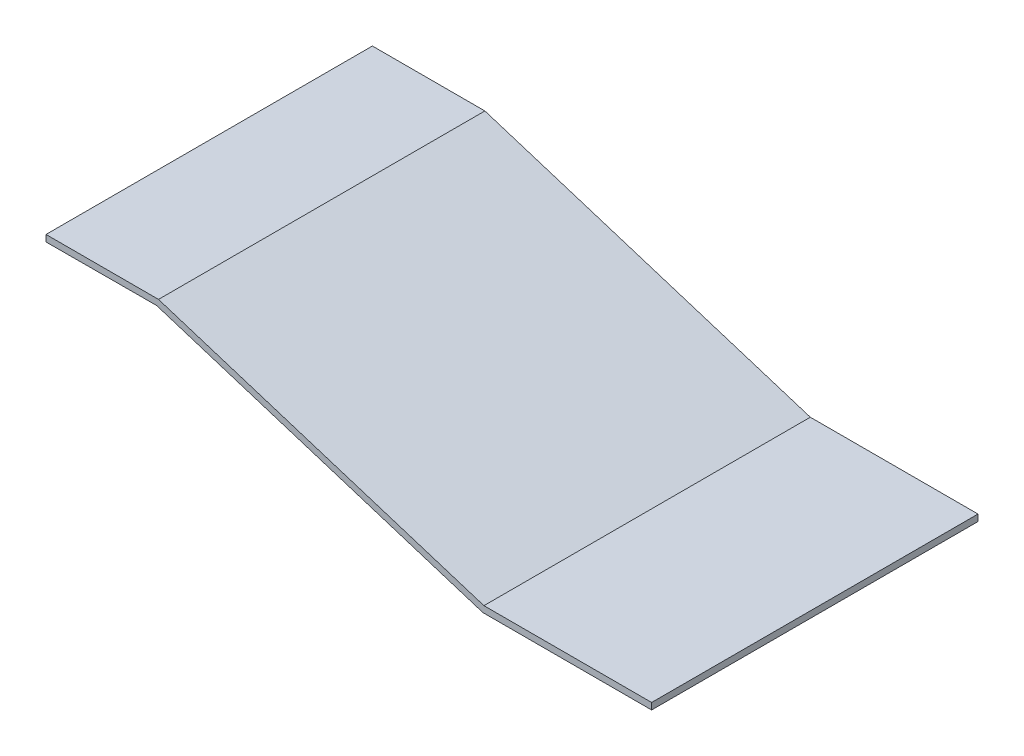
ISO-10303-21;
HEADER;
FILE_DESCRIPTION(('STEP AP214'),'2;1');
FILE_NAME('part.step','',(''),(''),'','','');
FILE_SCHEMA(('AUTOMOTIVE_DESIGN { 1 0 10303 214 1 1 1 1 }'));
ENDSEC;
DATA;
#1=APPLICATION_CONTEXT('core data for automotive mechanical design processes');
#2=APPLICATION_PROTOCOL_DEFINITION('international standard','automotive_design',2000,#1);
#3=PRODUCT_CONTEXT('',#1,'mechanical');
#4=PRODUCT('Part','Part','',(#3));
#5=PRODUCT_RELATED_PRODUCT_CATEGORY('part','',(#4));
#6=PRODUCT_DEFINITION_FORMATION('','',#4);
#7=PRODUCT_DEFINITION_CONTEXT('part definition',#1,'design');
#8=PRODUCT_DEFINITION('design','',#6,#7);
#9=PRODUCT_DEFINITION_SHAPE('','',#8);
#10=(LENGTH_UNIT() NAMED_UNIT(*) SI_UNIT(.MILLI.,.METRE.));
#11=(NAMED_UNIT(*) PLANE_ANGLE_UNIT() SI_UNIT($,.RADIAN.));
#12=(NAMED_UNIT(*) SI_UNIT($,.STERADIAN.) SOLID_ANGLE_UNIT());
#13=UNCERTAINTY_MEASURE_WITH_UNIT(LENGTH_MEASURE(1.E-05),#10,'distance_accuracy_value','');
#14=(GEOMETRIC_REPRESENTATION_CONTEXT(3) GLOBAL_UNCERTAINTY_ASSIGNED_CONTEXT((#13)) GLOBAL_UNIT_ASSIGNED_CONTEXT((#10,
#11,#12)) REPRESENTATION_CONTEXT('',''));
#15=CARTESIAN_POINT('',(0.,0.,0.));
#16=DIRECTION('',(0.,0.,1.));
#17=DIRECTION('',(1.,0.,0.));
#18=AXIS2_PLACEMENT_3D('',#15,#16,#17);
#19=CARTESIAN_POINT('',(1855.58831432889,-257.414889175095,1000.));
#20=DIRECTION('',(0.,-1.,0.));
#21=DIRECTION('',(0.,0.,-1.));
#22=AXIS2_PLACEMENT_3D('',#19,#20,#21);
#23=PLANE('',#22);
#24=DIRECTION('',(-1.,0.,0.));
#25=VECTOR('',#24,1.);
#26=CARTESIAN_POINT('',(1855.58831432889,-257.414889175095,1000.));
#27=LINE('',#26,#25);
#28=CARTESIAN_POINT('',(1855.58831432889,-257.414889175095,1000.));
#29=VERTEX_POINT('',#28);
#30=CARTESIAN_POINT('',(1338.71947180938,-257.414889175095,1000.));
#31=VERTEX_POINT('',#30);
#32=EDGE_CURVE('E230',#29,#31,#27,.T.);
#33=ORIENTED_EDGE('',*,*,#32,.T.);
#34=DIRECTION('',(0.,0.,-1.));
#35=VECTOR('',#34,1.);
#36=CARTESIAN_POINT('',(1338.71947180938,-257.414889175095,1000.));
#37=LINE('',#36,#35);
#38=CARTESIAN_POINT('',(1338.71947180938,-257.414889175095,0.));
#39=VERTEX_POINT('',#38);
#40=EDGE_CURVE('E213',#31,#39,#37,.T.);
#41=ORIENTED_EDGE('',*,*,#40,.T.);
#42=DIRECTION('',(-1.,0.,0.));
#43=VECTOR('',#42,1.);
#44=CARTESIAN_POINT('',(1855.58831432889,-257.414889175095,0.));
#45=LINE('',#44,#43);
#46=CARTESIAN_POINT('',(1855.58831432889,-257.414889175095,0.));
#47=VERTEX_POINT('',#46);
#48=EDGE_CURVE('E130',#47,#39,#45,.T.);
#49=ORIENTED_EDGE('',*,*,#48,.F.);
#50=DIRECTION('',(0.,0.,-1.));
#51=VECTOR('',#50,1.);
#52=CARTESIAN_POINT('',(1855.58831432889,-257.414889175095,1000.));
#53=LINE('',#52,#51);
#54=EDGE_CURVE('E79',#29,#47,#53,.T.);
#55=ORIENTED_EDGE('',*,*,#54,.F.);
#56=EDGE_LOOP('',(#33,#41,#49,#55));
#57=FACE_BOUND('',#56,.T.);
#58=ADVANCED_FACE('F69',(#57),#23,.T.);
#59=CARTESIAN_POINT('',(1855.58831432889,-237.414889175095,1000.));
#60=DIRECTION('',(1.,0.,0.));
#61=DIRECTION('',(0.,0.,-1.));
#62=AXIS2_PLACEMENT_3D('',#59,#60,#61);
#63=PLANE('',#62);
#64=DIRECTION('',(0.,-1.,0.));
#65=VECTOR('',#64,1.);
#66=CARTESIAN_POINT('',(1855.58831432889,-237.414889175095,0.));
#67=LINE('',#66,#65);
#68=CARTESIAN_POINT('',(1855.58831432889,-237.414889175095,0.));
#69=VERTEX_POINT('',#68);
#70=EDGE_CURVE('E241',#69,#47,#67,.T.);
#71=ORIENTED_EDGE('',*,*,#70,.F.);
#72=DIRECTION('',(0.,0.,-1.));
#73=VECTOR('',#72,1.);
#74=CARTESIAN_POINT('',(1855.58831432889,-237.414889175095,1000.));
#75=LINE('',#74,#73);
#76=CARTESIAN_POINT('',(1855.58831432889,-237.414889175095,1000.));
#77=VERTEX_POINT('',#76);
#78=EDGE_CURVE('E235',#77,#69,#75,.T.);
#79=ORIENTED_EDGE('',*,*,#78,.F.);
#80=DIRECTION('',(0.,-1.,0.));
#81=VECTOR('',#80,1.);
#82=CARTESIAN_POINT('',(1855.58831432889,-237.414889175095,1000.));
#83=LINE('',#82,#81);
#84=EDGE_CURVE('E239',#77,#29,#83,.T.);
#85=ORIENTED_EDGE('',*,*,#84,.T.);
#86=ORIENTED_EDGE('',*,*,#54,.T.);
#87=EDGE_LOOP('',(#71,#79,#85,#86));
#88=FACE_BOUND('',#87,.T.);
#89=ADVANCED_FACE('F192',(#88),#63,.T.);
#90=CARTESIAN_POINT('',(1338.71947180938,-237.414889175095,1000.));
#91=DIRECTION('',(0.,1.,0.));
#92=DIRECTION('',(0.,0.,1.));
#93=AXIS2_PLACEMENT_3D('',#90,#91,#92);
#94=PLANE('',#93);
#95=DIRECTION('',(0.,0.,-1.));
#96=VECTOR('',#95,1.);
#97=CARTESIAN_POINT('',(1341.79498395651,-237.414889175095,1000.));
#98=LINE('',#97,#96);
#99=CARTESIAN_POINT('',(1341.79498395651,-237.414889175096,1000.));
#100=VERTEX_POINT('',#99);
#101=CARTESIAN_POINT('',(1341.79498395651,-237.414889175096,0.));
#102=VERTEX_POINT('',#101);
#103=EDGE_CURVE('E12',#100,#102,#98,.T.);
#104=ORIENTED_EDGE('',*,*,#103,.F.);
#105=DIRECTION('',(1.,0.,0.));
#106=VECTOR('',#105,1.);
#107=CARTESIAN_POINT('',(1338.71947180938,-237.414889175095,1000.));
#108=LINE('',#107,#106);
#109=EDGE_CURVE('E232',#100,#77,#108,.T.);
#110=ORIENTED_EDGE('',*,*,#109,.T.);
#111=ORIENTED_EDGE('',*,*,#78,.T.);
#112=DIRECTION('',(1.,0.,0.));
#113=VECTOR('',#112,1.);
#114=CARTESIAN_POINT('',(1338.71947180938,-237.414889175095,0.));
#115=LINE('',#114,#113);
#116=EDGE_CURVE('E252',#102,#69,#115,.T.);
#117=ORIENTED_EDGE('',*,*,#116,.F.);
#118=EDGE_LOOP('',(#104,#110,#111,#117));
#119=FACE_BOUND('',#118,.T.);
#120=ADVANCED_FACE('F198',(#119),#94,.T.);
#121=CARTESIAN_POINT('',(0.,0.,0.));
#122=DIRECTION('',(0.,0.,-1.));
#123=DIRECTION('',(-1.,0.,0.));
#124=AXIS2_PLACEMENT_3D('',#121,#122,#123);
#125=PLANE('',#124);
#126=ORIENTED_EDGE('',*,*,#48,.T.);
#127=DIRECTION('',(-0.953798645697972,0.300446573394861,0.));
#128=VECTOR('',#127,1.);
#129=CARTESIAN_POINT('',(1338.71947180938,-257.414889175095,0.));
#130=LINE('',#129,#128);
#131=CARTESIAN_POINT('',(338.719471809376,57.5851108249049,0.));
#132=VERTEX_POINT('',#131);
#133=EDGE_CURVE('E170',#39,#132,#130,.T.);
#134=ORIENTED_EDGE('',*,*,#133,.T.);
#135=DIRECTION('',(-0.999996279025813,-0.00272799093250725,0.));
#136=VECTOR('',#135,1.);
#137=CARTESIAN_POINT('',(338.719471809376,57.5851108249049,0.));
#138=LINE('',#137,#136);
#139=CARTESIAN_POINT('',(0.,56.6610837388643,0.));
#140=VERTEX_POINT('',#139);
#141=EDGE_CURVE('E174',#132,#140,#138,.T.);
#142=ORIENTED_EDGE('',*,*,#141,.T.);
#143=DIRECTION('',(0.,1.,0.));
#144=VECTOR('',#143,1.);
#145=CARTESIAN_POINT('',(0.,56.6610837388643,0.));
#146=LINE('',#145,#144);
#147=CARTESIAN_POINT('',(0.,76.6610837388643,0.));
#148=VERTEX_POINT('',#147);
#149=EDGE_CURVE('E139',#140,#148,#146,.T.);
#150=ORIENTED_EDGE('',*,*,#149,.T.);
#151=DIRECTION('',(1.,0.,0.));
#152=VECTOR('',#151,1.);
#153=CARTESIAN_POINT('',(0.,76.6610837388643,0.));
#154=LINE('',#153,#152);
#155=CARTESIAN_POINT('',(344.728403277274,76.6610837388643,0.));
#156=VERTEX_POINT('',#155);
#157=EDGE_CURVE('E122',#148,#156,#154,.T.);
#158=ORIENTED_EDGE('',*,*,#157,.T.);
#159=DIRECTION('',(0.953798645697972,-0.300446573394861,0.));
#160=VECTOR('',#159,1.);
#161=CARTESIAN_POINT('',(344.728403277274,76.6610837388643,0.));
#162=LINE('',#161,#160);
#163=EDGE_CURVE('E137',#156,#102,#162,.T.);
#164=ORIENTED_EDGE('',*,*,#163,.T.);
#165=ORIENTED_EDGE('',*,*,#116,.T.);
#166=ORIENTED_EDGE('',*,*,#70,.T.);
#167=EDGE_LOOP('',(#126,#134,#142,#150,#158,#164,#165,#166));
#168=FACE_BOUND('',#167,.T.);
#169=ADVANCED_FACE('F135',(#168),#125,.T.);
#170=CARTESIAN_POINT('',(0.,0.,1000.));
#171=DIRECTION('',(0.,0.,-1.));
#172=DIRECTION('',(-1.,0.,0.));
#173=AXIS2_PLACEMENT_3D('',#170,#171,#172);
#174=PLANE('',#173);
#175=ORIENTED_EDGE('',*,*,#109,.F.);
#176=DIRECTION('',(0.953798645697972,-0.300446573394861,0.));
#177=VECTOR('',#176,1.);
#178=CARTESIAN_POINT('',(344.728403277274,76.6610837388643,1000.));
#179=LINE('',#178,#177);
#180=CARTESIAN_POINT('',(344.728403277274,76.6610837388643,1000.));
#181=VERTEX_POINT('',#180);
#182=EDGE_CURVE('E158',#181,#100,#179,.T.);
#183=ORIENTED_EDGE('',*,*,#182,.F.);
#184=DIRECTION('',(1.,0.,0.));
#185=VECTOR('',#184,1.);
#186=CARTESIAN_POINT('',(0.,76.6610837388643,1000.));
#187=LINE('',#186,#185);
#188=CARTESIAN_POINT('',(0.,76.6610837388643,1000.));
#189=VERTEX_POINT('',#188);
#190=EDGE_CURVE('E125',#189,#181,#187,.T.);
#191=ORIENTED_EDGE('',*,*,#190,.F.);
#192=DIRECTION('',(0.,1.,0.));
#193=VECTOR('',#192,1.);
#194=CARTESIAN_POINT('',(0.,56.6610837388643,1000.));
#195=LINE('',#194,#193);
#196=CARTESIAN_POINT('',(0.,56.6610837388643,1000.));
#197=VERTEX_POINT('',#196);
#198=EDGE_CURVE('E166',#197,#189,#195,.T.);
#199=ORIENTED_EDGE('',*,*,#198,.F.);
#200=DIRECTION('',(-0.999996279025813,-0.00272799093250725,0.));
#201=VECTOR('',#200,1.);
#202=CARTESIAN_POINT('',(338.719471809376,57.5851108249049,1000.));
#203=LINE('',#202,#201);
#204=CARTESIAN_POINT('',(338.719471809376,57.5851108249049,1000.));
#205=VERTEX_POINT('',#204);
#206=EDGE_CURVE('E148',#205,#197,#203,.T.);
#207=ORIENTED_EDGE('',*,*,#206,.F.);
#208=DIRECTION('',(-0.953798645697972,0.300446573394861,0.));
#209=VECTOR('',#208,1.);
#210=CARTESIAN_POINT('',(1338.71947180938,-257.414889175095,1000.));
#211=LINE('',#210,#209);
#212=EDGE_CURVE('E144',#31,#205,#211,.T.);
#213=ORIENTED_EDGE('',*,*,#212,.F.);
#214=ORIENTED_EDGE('',*,*,#32,.F.);
#215=ORIENTED_EDGE('',*,*,#84,.F.);
#216=EDGE_LOOP('',(#175,#183,#191,#199,#207,#213,#214,#215));
#217=FACE_BOUND('',#216,.T.);
#218=ADVANCED_FACE('F189',(#217),#174,.F.);
#219=CARTESIAN_POINT('',(0.,76.6610837388643,1000.));
#220=DIRECTION('',(0.,1.,0.));
#221=DIRECTION('',(0.,0.,1.));
#222=AXIS2_PLACEMENT_3D('',#219,#220,#221);
#223=PLANE('',#222);
#224=ORIENTED_EDGE('',*,*,#157,.F.);
#225=DIRECTION('',(0.,0.,-1.));
#226=VECTOR('',#225,1.);
#227=CARTESIAN_POINT('',(0.,76.6610837388643,1000.));
#228=LINE('',#227,#226);
#229=EDGE_CURVE('E114',#189,#148,#228,.T.);
#230=ORIENTED_EDGE('',*,*,#229,.F.);
#231=ORIENTED_EDGE('',*,*,#190,.T.);
#232=DIRECTION('',(0.,0.,-1.));
#233=VECTOR('',#232,1.);
#234=CARTESIAN_POINT('',(344.728403277274,76.6610837388643,1000.));
#235=LINE('',#234,#233);
#236=EDGE_CURVE('E119',#181,#156,#235,.T.);
#237=ORIENTED_EDGE('',*,*,#236,.T.);
#238=EDGE_LOOP('',(#224,#230,#231,#237));
#239=FACE_BOUND('',#238,.T.);
#240=ADVANCED_FACE('F121',(#239),#223,.T.);
#241=CARTESIAN_POINT('',(0.,56.6610837388643,1000.));
#242=DIRECTION('',(-1.,0.,0.));
#243=DIRECTION('',(0.,0.,1.));
#244=AXIS2_PLACEMENT_3D('',#241,#242,#243);
#245=PLANE('',#244);
#246=ORIENTED_EDGE('',*,*,#149,.F.);
#247=DIRECTION('',(0.,0.,-1.));
#248=VECTOR('',#247,1.);
#249=CARTESIAN_POINT('',(0.,56.6610837388643,1000.));
#250=LINE('',#249,#248);
#251=EDGE_CURVE('E154',#197,#140,#250,.T.);
#252=ORIENTED_EDGE('',*,*,#251,.F.);
#253=ORIENTED_EDGE('',*,*,#198,.T.);
#254=ORIENTED_EDGE('',*,*,#229,.T.);
#255=EDGE_LOOP('',(#246,#252,#253,#254));
#256=FACE_BOUND('',#255,.T.);
#257=ADVANCED_FACE('F182',(#256),#245,.T.);
#258=CARTESIAN_POINT('',(338.719471809376,57.5851108249049,1000.));
#259=DIRECTION('',(0.00272799093250725,-0.999996279025813,0.));
#260=DIRECTION('',(0.999996279025813,0.00272799093250725,0.));
#261=AXIS2_PLACEMENT_3D('',#258,#259,#260);
#262=PLANE('',#261);
#263=ORIENTED_EDGE('',*,*,#141,.F.);
#264=DIRECTION('',(0.,0.,-1.));
#265=VECTOR('',#264,1.);
#266=CARTESIAN_POINT('',(338.719471809376,57.5851108249049,1000.));
#267=LINE('',#266,#265);
#268=EDGE_CURVE('E156',#205,#132,#267,.T.);
#269=ORIENTED_EDGE('',*,*,#268,.F.);
#270=ORIENTED_EDGE('',*,*,#206,.T.);
#271=ORIENTED_EDGE('',*,*,#251,.T.);
#272=EDGE_LOOP('',(#263,#269,#270,#271));
#273=FACE_BOUND('',#272,.T.);
#274=ADVANCED_FACE('F178',(#273),#262,.T.);
#275=CARTESIAN_POINT('',(1338.71947180938,-257.414889175095,1000.));
#276=DIRECTION('',(-0.300446573394861,-0.953798645697972,0.));
#277=DIRECTION('',(0.953798645697972,-0.300446573394861,0.));
#278=AXIS2_PLACEMENT_3D('',#275,#276,#277);
#279=PLANE('',#278);
#280=ORIENTED_EDGE('',*,*,#133,.F.);
#281=ORIENTED_EDGE('',*,*,#40,.F.);
#282=ORIENTED_EDGE('',*,*,#212,.T.);
#283=ORIENTED_EDGE('',*,*,#268,.T.);
#284=EDGE_LOOP('',(#280,#281,#282,#283));
#285=FACE_BOUND('',#284,.T.);
#286=ADVANCED_FACE('F71',(#285),#279,.T.);
#287=CARTESIAN_POINT('',(344.728403277274,76.6610837388643,1000.));
#288=DIRECTION('',(0.300446573394861,0.953798645697972,0.));
#289=DIRECTION('',(-0.953798645697972,0.300446573394861,0.));
#290=AXIS2_PLACEMENT_3D('',#287,#288,#289);
#291=PLANE('',#290);
#292=ORIENTED_EDGE('',*,*,#182,.T.);
#293=ORIENTED_EDGE('',*,*,#103,.T.);
#294=ORIENTED_EDGE('',*,*,#163,.F.);
#295=ORIENTED_EDGE('',*,*,#236,.F.);
#296=EDGE_LOOP('',(#292,#293,#294,#295));
#297=FACE_BOUND('',#296,.T.);
#298=ADVANCED_FACE('F142',(#297),#291,.T.);
#299=CLOSED_SHELL('',(#58,#89,#120,#169,#218,#240,#257,#274,#286,#298));
#300=MANIFOLD_SOLID_BREP('B2',#299);
#301=ADVANCED_BREP_SHAPE_REPRESENTATION('',(#18,#300),#14);
#302=SHAPE_DEFINITION_REPRESENTATION(#9,#301);
ENDSEC;
END-ISO-10303-21;
